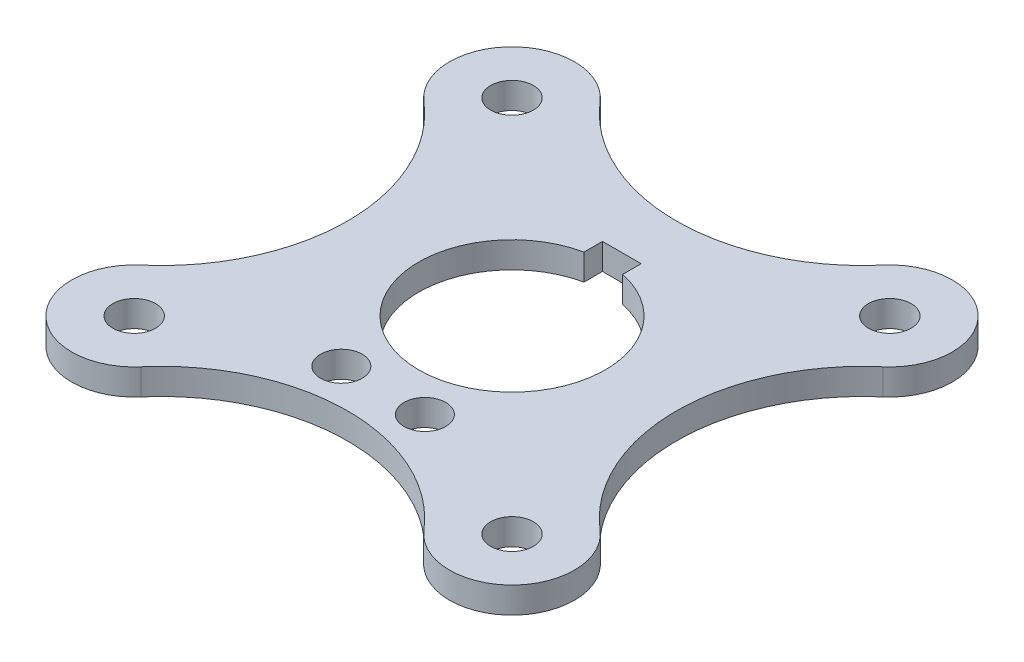
ISO-10303-21;
HEADER;
FILE_DESCRIPTION(('STEP AP214'),'2;1');
FILE_NAME('part.step','',(''),(''),'','','');
FILE_SCHEMA(('AUTOMOTIVE_DESIGN { 1 0 10303 214 1 1 1 1 }'));
ENDSEC;
DATA;
#1=APPLICATION_CONTEXT('core data for automotive mechanical design processes');
#2=APPLICATION_PROTOCOL_DEFINITION('international standard','automotive_design',2000,#1);
#3=PRODUCT_CONTEXT('',#1,'mechanical');
#4=PRODUCT('Part','Part','',(#3));
#5=PRODUCT_RELATED_PRODUCT_CATEGORY('part','',(#4));
#6=PRODUCT_DEFINITION_FORMATION('','',#4);
#7=PRODUCT_DEFINITION_CONTEXT('part definition',#1,'design');
#8=PRODUCT_DEFINITION('design','',#6,#7);
#9=PRODUCT_DEFINITION_SHAPE('','',#8);
#10=(LENGTH_UNIT() NAMED_UNIT(*) SI_UNIT(.MILLI.,.METRE.));
#11=(NAMED_UNIT(*) PLANE_ANGLE_UNIT() SI_UNIT($,.RADIAN.));
#12=(NAMED_UNIT(*) SI_UNIT($,.STERADIAN.) SOLID_ANGLE_UNIT());
#13=UNCERTAINTY_MEASURE_WITH_UNIT(LENGTH_MEASURE(1.E-05),#10,'distance_accuracy_value','');
#14=(GEOMETRIC_REPRESENTATION_CONTEXT(3) GLOBAL_UNCERTAINTY_ASSIGNED_CONTEXT((#13)) GLOBAL_UNIT_ASSIGNED_CONTEXT((#10,
#11,#12)) REPRESENTATION_CONTEXT('',''));
#15=CARTESIAN_POINT('',(0.,0.,0.));
#16=DIRECTION('',(0.,0.,1.));
#17=DIRECTION('',(1.,0.,0.));
#18=AXIS2_PLACEMENT_3D('',#15,#16,#17);
#19=CARTESIAN_POINT('',(-32.813907500035,3.175,-11.4904851942816));
#20=DIRECTION('',(0.,1.,0.));
#21=DIRECTION('',(0.,0.,1.));
#22=AXIS2_PLACEMENT_3D('',#19,#20,#21);
#23=PLANE('',#22);
#24=CARTESIAN_POINT('',(-5.08,3.175,15.6797222222222));
#25=DIRECTION('',(0.,1.,0.));
#26=DIRECTION('',(0.,0.,1.));
#27=AXIS2_PLACEMENT_3D('',#24,#25,#26);
#28=CIRCLE('',#27,2.54);
#29=CARTESIAN_POINT('',(-5.08,3.175,18.2197222222222));
#30=VERTEX_POINT('',#29);
#31=EDGE_CURVE('E268',#30,#30,#28,.T.);
#32=ORIENTED_EDGE('',*,*,#31,.F.);
#33=EDGE_LOOP('',(#32));
#34=FACE_BOUND('',#33,.T.);
#35=CARTESIAN_POINT('',(5.08,3.175,15.6797222222222));
#36=DIRECTION('',(0.,1.,0.));
#37=DIRECTION('',(0.,0.,1.));
#38=AXIS2_PLACEMENT_3D('',#35,#36,#37);
#39=CIRCLE('',#38,2.54);
#40=CARTESIAN_POINT('',(5.08,3.175,18.2197222222222));
#41=VERTEX_POINT('',#40);
#42=EDGE_CURVE('E276',#41,#41,#39,.T.);
#43=ORIENTED_EDGE('',*,*,#42,.F.);
#44=EDGE_LOOP('',(#43));
#45=FACE_BOUND('',#44,.T.);
#46=CARTESIAN_POINT('',(-22.980970388563,3.175,22.9809703885626));
#47=DIRECTION('',(0.,1.,0.));
#48=DIRECTION('',(0.,0.,1.));
#49=AXIS2_PLACEMENT_3D('',#46,#47,#48);
#50=CIRCLE('',#49,2.6);
#51=CARTESIAN_POINT('',(-22.980970388563,3.175,25.5809703885626));
#52=VERTEX_POINT('',#51);
#53=EDGE_CURVE('E292',#52,#52,#50,.T.);
#54=ORIENTED_EDGE('',*,*,#53,.F.);
#55=EDGE_LOOP('',(#54));
#56=FACE_BOUND('',#55,.T.);
#57=CARTESIAN_POINT('',(22.9809703885628,3.175,-22.9809703885628));
#58=DIRECTION('',(0.,1.,0.));
#59=DIRECTION('',(0.,0.,1.));
#60=AXIS2_PLACEMENT_3D('',#57,#58,#59);
#61=CIRCLE('',#60,2.6);
#62=CARTESIAN_POINT('',(22.9809703885628,3.175,-20.3809703885628));
#63=VERTEX_POINT('',#62);
#64=EDGE_CURVE('E174',#63,#63,#61,.T.);
#65=ORIENTED_EDGE('',*,*,#64,.F.);
#66=EDGE_LOOP('',(#65));
#67=FACE_BOUND('',#66,.T.);
#68=CARTESIAN_POINT('',(-42.6468446115075,3.175,0.));
#69=DIRECTION('',(0.,-1.,0.));
#70=DIRECTION('',(0.,0.,1.));
#71=AXIS2_PLACEMENT_3D('',#68,#69,#70);
#72=CIRCLE('',#71,22.6468446115076);
#73=CARTESIAN_POINT('',(-27.922333562608,3.175,-17.2066366623063));
#74=VERTEX_POINT('',#73);
#75=CARTESIAN_POINT('',(-27.9223335626085,3.175,17.2066366623057));
#76=VERTEX_POINT('',#75);
#77=EDGE_CURVE('E190',#74,#76,#72,.T.);
#78=ORIENTED_EDGE('',*,*,#77,.T.);
#79=CARTESIAN_POINT('',(-22.980970388563,3.175,22.9809703885626));
#80=DIRECTION('',(0.,1.,0.));
#81=DIRECTION('',(0.,0.,1.));
#82=AXIS2_PLACEMENT_3D('',#79,#80,#81);
#83=CIRCLE('',#82,7.6);
#84=CARTESIAN_POINT('',(-17.2066366623062,3.175,27.9223335626081));
#85=VERTEX_POINT('',#84);
#86=EDGE_CURVE('E194',#76,#85,#83,.T.);
#87=ORIENTED_EDGE('',*,*,#86,.T.);
#88=CARTESIAN_POINT('',(0.,3.175,42.6468446115075));
#89=DIRECTION('',(0.,-1.,0.));
#90=DIRECTION('',(0.,0.,1.));
#91=AXIS2_PLACEMENT_3D('',#88,#89,#90);
#92=CIRCLE('',#91,22.6468446115075);
#93=CARTESIAN_POINT('',(17.2066366623059,3.175,27.9223335626083));
#94=VERTEX_POINT('',#93);
#95=EDGE_CURVE('E198',#85,#94,#92,.T.);
#96=ORIENTED_EDGE('',*,*,#95,.T.);
#97=CARTESIAN_POINT('',(22.9809703885627,3.175,22.9809703885629));
#98=DIRECTION('',(0.,1.,0.));
#99=DIRECTION('',(0.,0.,1.));
#100=AXIS2_PLACEMENT_3D('',#97,#98,#99);
#101=CIRCLE('',#100,7.6);
#102=CARTESIAN_POINT('',(27.9223335626082,3.175,17.2066366623061));
#103=VERTEX_POINT('',#102);
#104=EDGE_CURVE('E201',#94,#103,#101,.T.);
#105=ORIENTED_EDGE('',*,*,#104,.T.);
#106=CARTESIAN_POINT('',(42.6468446115075,3.175,0.));
#107=DIRECTION('',(0.,-1.,0.));
#108=DIRECTION('',(0.,0.,1.));
#109=AXIS2_PLACEMENT_3D('',#106,#107,#108);
#110=CIRCLE('',#109,22.6468446115075);
#111=CARTESIAN_POINT('',(27.9223335626083,3.175,-17.2066366623059));
#112=VERTEX_POINT('',#111);
#113=EDGE_CURVE('E204',#103,#112,#110,.T.);
#114=ORIENTED_EDGE('',*,*,#113,.T.);
#115=CARTESIAN_POINT('',(22.9809703885628,3.175,-22.9809703885627));
#116=DIRECTION('',(0.,1.,0.));
#117=DIRECTION('',(0.,0.,1.));
#118=AXIS2_PLACEMENT_3D('',#115,#116,#117);
#119=CIRCLE('',#118,7.60000000000001);
#120=CARTESIAN_POINT('',(17.206636662306,3.175,-27.9223335626083));
#121=VERTEX_POINT('',#120);
#122=EDGE_CURVE('E207',#112,#121,#119,.T.);
#123=ORIENTED_EDGE('',*,*,#122,.T.);
#124=CARTESIAN_POINT('',(0.,3.175,-42.6468446115075));
#125=DIRECTION('',(0.,-1.,0.));
#126=DIRECTION('',(0.,0.,1.));
#127=AXIS2_PLACEMENT_3D('',#124,#125,#126);
#128=CIRCLE('',#127,22.6468446115075);
#129=CARTESIAN_POINT('',(-17.2066366623059,3.175,-27.9223335626084));
#130=VERTEX_POINT('',#129);
#131=EDGE_CURVE('E210',#121,#130,#128,.T.);
#132=ORIENTED_EDGE('',*,*,#131,.T.);
#133=CARTESIAN_POINT('',(-22.9809703885625,3.175,-22.9809703885631));
#134=DIRECTION('',(0.,1.,0.));
#135=DIRECTION('',(0.,0.,1.));
#136=AXIS2_PLACEMENT_3D('',#133,#134,#135);
#137=CIRCLE('',#136,7.60000000000001);
#138=EDGE_CURVE('E213',#130,#74,#137,.T.);
#139=ORIENTED_EDGE('',*,*,#138,.T.);
#140=EDGE_LOOP('',(#78,#87,#96,#105,#114,#123,#132,#139));
#141=FACE_BOUND('',#140,.T.);
#142=CARTESIAN_POINT('',(0.,3.175,0.));
#143=DIRECTION('',(0.,1.,0.));
#144=DIRECTION('',(0.,0.,1.));
#145=AXIS2_PLACEMENT_3D('',#142,#143,#144);
#146=CIRCLE('',#145,11.3594444444444);
#147=CARTESIAN_POINT('',(-2.35326156738769,3.175,-11.113016605849));
#148=VERTEX_POINT('',#147);
#149=CARTESIAN_POINT('',(2.3532615673877,3.175,-11.113016605849));
#150=VERTEX_POINT('',#149);
#151=EDGE_CURVE('E148',#148,#150,#146,.T.);
#152=ORIENTED_EDGE('',*,*,#151,.F.);
#153=DIRECTION('',(0.,0.,1.));
#154=VECTOR('',#153,1.);
#155=CARTESIAN_POINT('',(-2.3532615673877,3.175,-13.3594444444444));
#156=LINE('',#155,#154);
#157=CARTESIAN_POINT('',(-2.3532615673877,3.175,-13.3594444444444));
#158=VERTEX_POINT('',#157);
#159=EDGE_CURVE('E139',#158,#148,#156,.T.);
#160=ORIENTED_EDGE('',*,*,#159,.F.);
#161=DIRECTION('',(-1.,0.,0.));
#162=VECTOR('',#161,1.);
#163=CARTESIAN_POINT('',(2.3532615673877,3.175,-13.3594444444444));
#164=LINE('',#163,#162);
#165=CARTESIAN_POINT('',(2.35326156738769,3.175,-13.3594444444444));
#166=VERTEX_POINT('',#165);
#167=EDGE_CURVE('E166',#166,#158,#164,.T.);
#168=ORIENTED_EDGE('',*,*,#167,.F.);
#169=DIRECTION('',(0.,0.,-1.));
#170=VECTOR('',#169,1.);
#171=CARTESIAN_POINT('',(2.3532615673877,3.175,-13.3594444444444));
#172=LINE('',#171,#170);
#173=EDGE_CURVE('E162',#150,#166,#172,.T.);
#174=ORIENTED_EDGE('',*,*,#173,.F.);
#175=EDGE_LOOP('',(#152,#160,#168,#174));
#176=FACE_BOUND('',#175,.T.);
#177=CARTESIAN_POINT('',(22.9809703885627,3.175,22.9809703885629));
#178=DIRECTION('',(0.,1.,0.));
#179=DIRECTION('',(0.,0.,1.));
#180=AXIS2_PLACEMENT_3D('',#177,#178,#179);
#181=CIRCLE('',#180,2.6);
#182=CARTESIAN_POINT('',(22.9809703885627,3.175,25.5809703885629));
#183=VERTEX_POINT('',#182);
#184=EDGE_CURVE('E300',#183,#183,#181,.T.);
#185=ORIENTED_EDGE('',*,*,#184,.F.);
#186=EDGE_LOOP('',(#185));
#187=FACE_BOUND('',#186,.T.);
#188=CARTESIAN_POINT('',(-22.9809703885625,3.175,-22.9809703885631));
#189=DIRECTION('',(0.,1.,0.));
#190=DIRECTION('',(0.,0.,1.));
#191=AXIS2_PLACEMENT_3D('',#188,#189,#190);
#192=CIRCLE('',#191,2.6);
#193=CARTESIAN_POINT('',(-22.9809703885625,3.175,-20.3809703885631));
#194=VERTEX_POINT('',#193);
#195=EDGE_CURVE('E284',#194,#194,#192,.T.);
#196=ORIENTED_EDGE('',*,*,#195,.F.);
#197=EDGE_LOOP('',(#196));
#198=FACE_BOUND('',#197,.T.);
#199=ADVANCED_FACE('F47',(#34,#45,#56,#67,#141,#176,#187,#198),#23,.T.);
#200=CARTESIAN_POINT('',(-32.813907500035,0.,-11.4904851942816));
#201=DIRECTION('',(0.,1.,0.));
#202=DIRECTION('',(0.,0.,1.));
#203=AXIS2_PLACEMENT_3D('',#200,#201,#202);
#204=PLANE('',#203);
#205=CARTESIAN_POINT('',(-5.08,0.,15.6797222222222));
#206=DIRECTION('',(0.,1.,0.));
#207=DIRECTION('',(0.,0.,1.));
#208=AXIS2_PLACEMENT_3D('',#205,#206,#207);
#209=CIRCLE('',#208,2.54);
#210=CARTESIAN_POINT('',(-5.08,0.,18.2197222222222));
#211=VERTEX_POINT('',#210);
#212=EDGE_CURVE('E51',#211,#211,#209,.T.);
#213=ORIENTED_EDGE('',*,*,#212,.T.);
#214=EDGE_LOOP('',(#213));
#215=FACE_BOUND('',#214,.T.);
#216=CARTESIAN_POINT('',(5.08,0.,15.6797222222222));
#217=DIRECTION('',(0.,1.,0.));
#218=DIRECTION('',(0.,0.,1.));
#219=AXIS2_PLACEMENT_3D('',#216,#217,#218);
#220=CIRCLE('',#219,2.54);
#221=CARTESIAN_POINT('',(5.08,0.,18.2197222222222));
#222=VERTEX_POINT('',#221);
#223=EDGE_CURVE('E265',#222,#222,#220,.T.);
#224=ORIENTED_EDGE('',*,*,#223,.T.);
#225=EDGE_LOOP('',(#224));
#226=FACE_BOUND('',#225,.T.);
#227=CARTESIAN_POINT('',(-42.6468446115075,0.,0.));
#228=DIRECTION('',(0.,-1.,0.));
#229=DIRECTION('',(0.,0.,1.));
#230=AXIS2_PLACEMENT_3D('',#227,#228,#229);
#231=CIRCLE('',#230,22.6468446115076);
#232=CARTESIAN_POINT('',(-27.922333562608,0.,-17.2066366623063));
#233=VERTEX_POINT('',#232);
#234=CARTESIAN_POINT('',(-27.9223335626085,0.,17.2066366623057));
#235=VERTEX_POINT('',#234);
#236=EDGE_CURVE('E157',#233,#235,#231,.T.);
#237=ORIENTED_EDGE('',*,*,#236,.F.);
#238=CARTESIAN_POINT('',(-22.9809703885625,0.,-22.9809703885631));
#239=DIRECTION('',(0.,1.,0.));
#240=DIRECTION('',(0.,0.,1.));
#241=AXIS2_PLACEMENT_3D('',#238,#239,#240);
#242=CIRCLE('',#241,7.60000000000001);
#243=CARTESIAN_POINT('',(-17.2066366623059,0.,-27.9223335626084));
#244=VERTEX_POINT('',#243);
#245=EDGE_CURVE('E195',#244,#233,#242,.T.);
#246=ORIENTED_EDGE('',*,*,#245,.F.);
#247=CARTESIAN_POINT('',(0.,0.,-42.6468446115075));
#248=DIRECTION('',(0.,-1.,0.));
#249=DIRECTION('',(0.,0.,1.));
#250=AXIS2_PLACEMENT_3D('',#247,#248,#249);
#251=CIRCLE('',#250,22.6468446115075);
#252=CARTESIAN_POINT('',(17.206636662306,0.,-27.9223335626083));
#253=VERTEX_POINT('',#252);
#254=EDGE_CURVE('E235',#253,#244,#251,.T.);
#255=ORIENTED_EDGE('',*,*,#254,.F.);
#256=CARTESIAN_POINT('',(22.9809703885628,0.,-22.9809703885627));
#257=DIRECTION('',(0.,1.,0.));
#258=DIRECTION('',(0.,0.,1.));
#259=AXIS2_PLACEMENT_3D('',#256,#257,#258);
#260=CIRCLE('',#259,7.60000000000001);
#261=CARTESIAN_POINT('',(27.9223335626083,0.,-17.2066366623059));
#262=VERTEX_POINT('',#261);
#263=EDGE_CURVE('E232',#262,#253,#260,.T.);
#264=ORIENTED_EDGE('',*,*,#263,.F.);
#265=CARTESIAN_POINT('',(42.6468446115075,0.,0.));
#266=DIRECTION('',(0.,-1.,0.));
#267=DIRECTION('',(0.,0.,1.));
#268=AXIS2_PLACEMENT_3D('',#265,#266,#267);
#269=CIRCLE('',#268,22.6468446115075);
#270=CARTESIAN_POINT('',(27.9223335626082,0.,17.2066366623061));
#271=VERTEX_POINT('',#270);
#272=EDGE_CURVE('E229',#271,#262,#269,.T.);
#273=ORIENTED_EDGE('',*,*,#272,.F.);
#274=CARTESIAN_POINT('',(22.9809703885627,0.,22.9809703885629));
#275=DIRECTION('',(0.,1.,0.));
#276=DIRECTION('',(0.,0.,1.));
#277=AXIS2_PLACEMENT_3D('',#274,#275,#276);
#278=CIRCLE('',#277,7.6);
#279=CARTESIAN_POINT('',(17.2066366623059,0.,27.9223335626083));
#280=VERTEX_POINT('',#279);
#281=EDGE_CURVE('E226',#280,#271,#278,.T.);
#282=ORIENTED_EDGE('',*,*,#281,.F.);
#283=CARTESIAN_POINT('',(0.,0.,42.6468446115075));
#284=DIRECTION('',(0.,-1.,0.));
#285=DIRECTION('',(0.,0.,1.));
#286=AXIS2_PLACEMENT_3D('',#283,#284,#285);
#287=CIRCLE('',#286,22.6468446115075);
#288=CARTESIAN_POINT('',(-17.2066366623062,0.,27.9223335626081));
#289=VERTEX_POINT('',#288);
#290=EDGE_CURVE('E223',#289,#280,#287,.T.);
#291=ORIENTED_EDGE('',*,*,#290,.F.);
#292=CARTESIAN_POINT('',(-22.980970388563,0.,22.9809703885626));
#293=DIRECTION('',(0.,1.,0.));
#294=DIRECTION('',(0.,0.,1.));
#295=AXIS2_PLACEMENT_3D('',#292,#293,#294);
#296=CIRCLE('',#295,7.6);
#297=EDGE_CURVE('E220',#235,#289,#296,.T.);
#298=ORIENTED_EDGE('',*,*,#297,.F.);
#299=EDGE_LOOP('',(#237,#246,#255,#264,#273,#282,#291,#298));
#300=FACE_BOUND('',#299,.T.);
#301=DIRECTION('',(0.,0.,1.));
#302=VECTOR('',#301,1.);
#303=CARTESIAN_POINT('',(-2.3532615673877,0.,-13.3594444444444));
#304=LINE('',#303,#302);
#305=CARTESIAN_POINT('',(-2.3532615673877,0.,-13.3594444444444));
#306=VERTEX_POINT('',#305);
#307=CARTESIAN_POINT('',(-2.35326156738769,0.,-11.113016605849));
#308=VERTEX_POINT('',#307);
#309=EDGE_CURVE('E73',#306,#308,#304,.T.);
#310=ORIENTED_EDGE('',*,*,#309,.T.);
#311=CARTESIAN_POINT('',(0.,0.,0.));
#312=DIRECTION('',(0.,1.,0.));
#313=DIRECTION('',(0.,0.,1.));
#314=AXIS2_PLACEMENT_3D('',#311,#312,#313);
#315=CIRCLE('',#314,11.3594444444444);
#316=CARTESIAN_POINT('',(2.3532615673877,0.,-11.113016605849));
#317=VERTEX_POINT('',#316);
#318=EDGE_CURVE('E155',#308,#317,#315,.T.);
#319=ORIENTED_EDGE('',*,*,#318,.T.);
#320=DIRECTION('',(0.,0.,-1.));
#321=VECTOR('',#320,1.);
#322=CARTESIAN_POINT('',(2.3532615673877,0.,-13.3594444444444));
#323=LINE('',#322,#321);
#324=CARTESIAN_POINT('',(2.3532615673877,0.,-13.3594444444444));
#325=VERTEX_POINT('',#324);
#326=EDGE_CURVE('E177',#317,#325,#323,.T.);
#327=ORIENTED_EDGE('',*,*,#326,.T.);
#328=DIRECTION('',(-1.,0.,0.));
#329=VECTOR('',#328,1.);
#330=CARTESIAN_POINT('',(2.3532615673877,0.,-13.3594444444444));
#331=LINE('',#330,#329);
#332=EDGE_CURVE('E149',#325,#306,#331,.T.);
#333=ORIENTED_EDGE('',*,*,#332,.T.);
#334=EDGE_LOOP('',(#310,#319,#327,#333));
#335=FACE_BOUND('',#334,.T.);
#336=CARTESIAN_POINT('',(22.9809703885628,0.,-22.9809703885628));
#337=DIRECTION('',(0.,1.,0.));
#338=DIRECTION('',(0.,0.,1.));
#339=AXIS2_PLACEMENT_3D('',#336,#337,#338);
#340=CIRCLE('',#339,2.6);
#341=CARTESIAN_POINT('',(22.9809703885628,0.,-20.3809703885628));
#342=VERTEX_POINT('',#341);
#343=EDGE_CURVE('E304',#342,#342,#340,.T.);
#344=ORIENTED_EDGE('',*,*,#343,.T.);
#345=EDGE_LOOP('',(#344));
#346=FACE_BOUND('',#345,.T.);
#347=CARTESIAN_POINT('',(22.9809703885627,0.,22.9809703885629));
#348=DIRECTION('',(0.,1.,0.));
#349=DIRECTION('',(0.,0.,1.));
#350=AXIS2_PLACEMENT_3D('',#347,#348,#349);
#351=CIRCLE('',#350,2.6);
#352=CARTESIAN_POINT('',(22.9809703885627,0.,25.5809703885629));
#353=VERTEX_POINT('',#352);
#354=EDGE_CURVE('E296',#353,#353,#351,.T.);
#355=ORIENTED_EDGE('',*,*,#354,.T.);
#356=EDGE_LOOP('',(#355));
#357=FACE_BOUND('',#356,.T.);
#358=CARTESIAN_POINT('',(-22.980970388563,0.,22.9809703885626));
#359=DIRECTION('',(0.,1.,0.));
#360=DIRECTION('',(0.,0.,1.));
#361=AXIS2_PLACEMENT_3D('',#358,#359,#360);
#362=CIRCLE('',#361,2.6);
#363=CARTESIAN_POINT('',(-22.980970388563,0.,25.5809703885626));
#364=VERTEX_POINT('',#363);
#365=EDGE_CURVE('E288',#364,#364,#362,.T.);
#366=ORIENTED_EDGE('',*,*,#365,.T.);
#367=EDGE_LOOP('',(#366));
#368=FACE_BOUND('',#367,.T.);
#369=CARTESIAN_POINT('',(-22.9809703885625,0.,-22.9809703885631));
#370=DIRECTION('',(0.,1.,0.));
#371=DIRECTION('',(0.,0.,1.));
#372=AXIS2_PLACEMENT_3D('',#369,#370,#371);
#373=CIRCLE('',#372,2.6);
#374=CARTESIAN_POINT('',(-22.9809703885625,0.,-20.3809703885631));
#375=VERTEX_POINT('',#374);
#376=EDGE_CURVE('E274',#375,#375,#373,.T.);
#377=ORIENTED_EDGE('',*,*,#376,.T.);
#378=EDGE_LOOP('',(#377));
#379=FACE_BOUND('',#378,.T.);
#380=ADVANCED_FACE('F314',(#215,#226,#300,#335,#346,#357,#368,#379),#204,.F.);
#381=CARTESIAN_POINT('',(-42.6468446115075,3.175,0.));
#382=DIRECTION('',(0.,-1.,0.));
#383=DIRECTION('',(0.,0.,-1.));
#384=AXIS2_PLACEMENT_3D('',#381,#382,#383);
#385=CYLINDRICAL_SURFACE('',#384,22.6468446115076);
#386=ORIENTED_EDGE('',*,*,#236,.T.);
#387=DIRECTION('',(0.,-1.,0.));
#388=VECTOR('',#387,1.);
#389=CARTESIAN_POINT('',(-27.9223335626085,3.175,17.2066366623057));
#390=LINE('',#389,#388);
#391=EDGE_CURVE('E11',#76,#235,#390,.T.);
#392=ORIENTED_EDGE('',*,*,#391,.F.);
#393=ORIENTED_EDGE('',*,*,#77,.F.);
#394=DIRECTION('',(0.,-1.,0.));
#395=VECTOR('',#394,1.);
#396=CARTESIAN_POINT('',(-27.922333562608,3.175,-17.2066366623063));
#397=LINE('',#396,#395);
#398=EDGE_CURVE('E216',#74,#233,#397,.T.);
#399=ORIENTED_EDGE('',*,*,#398,.T.);
#400=EDGE_LOOP('',(#386,#392,#393,#399));
#401=FACE_BOUND('',#400,.T.);
#402=ADVANCED_FACE('F49',(#401),#385,.F.);
#403=CARTESIAN_POINT('',(-22.980970388563,3.175,22.9809703885626));
#404=DIRECTION('',(0.,-1.,0.));
#405=DIRECTION('',(0.,0.,-1.));
#406=AXIS2_PLACEMENT_3D('',#403,#404,#405);
#407=CYLINDRICAL_SURFACE('',#406,7.6);
#408=ORIENTED_EDGE('',*,*,#297,.T.);
#409=DIRECTION('',(0.,-1.,0.));
#410=VECTOR('',#409,1.);
#411=CARTESIAN_POINT('',(-17.2066366623062,3.175,27.9223335626081));
#412=LINE('',#411,#410);
#413=EDGE_CURVE('E57',#85,#289,#412,.T.);
#414=ORIENTED_EDGE('',*,*,#413,.F.);
#415=ORIENTED_EDGE('',*,*,#86,.F.);
#416=ORIENTED_EDGE('',*,*,#391,.T.);
#417=EDGE_LOOP('',(#408,#414,#415,#416));
#418=FACE_BOUND('',#417,.T.);
#419=ADVANCED_FACE('F367',(#418),#407,.T.);
#420=CARTESIAN_POINT('',(0.,3.175,42.6468446115075));
#421=DIRECTION('',(0.,-1.,0.));
#422=DIRECTION('',(0.,0.,-1.));
#423=AXIS2_PLACEMENT_3D('',#420,#421,#422);
#424=CYLINDRICAL_SURFACE('',#423,22.6468446115075);
#425=ORIENTED_EDGE('',*,*,#290,.T.);
#426=DIRECTION('',(0.,-1.,0.));
#427=VECTOR('',#426,1.);
#428=CARTESIAN_POINT('',(17.2066366623059,3.175,27.9223335626083));
#429=LINE('',#428,#427);
#430=EDGE_CURVE('E259',#94,#280,#429,.T.);
#431=ORIENTED_EDGE('',*,*,#430,.F.);
#432=ORIENTED_EDGE('',*,*,#95,.F.);
#433=ORIENTED_EDGE('',*,*,#413,.T.);
#434=EDGE_LOOP('',(#425,#431,#432,#433));
#435=FACE_BOUND('',#434,.T.);
#436=ADVANCED_FACE('F364',(#435),#424,.F.);
#437=CARTESIAN_POINT('',(22.9809703885627,3.175,22.9809703885629));
#438=DIRECTION('',(0.,-1.,0.));
#439=DIRECTION('',(0.,0.,-1.));
#440=AXIS2_PLACEMENT_3D('',#437,#438,#439);
#441=CYLINDRICAL_SURFACE('',#440,7.6);
#442=ORIENTED_EDGE('',*,*,#281,.T.);
#443=DIRECTION('',(0.,-1.,0.));
#444=VECTOR('',#443,1.);
#445=CARTESIAN_POINT('',(27.9223335626082,3.175,17.2066366623061));
#446=LINE('',#445,#444);
#447=EDGE_CURVE('E255',#103,#271,#446,.T.);
#448=ORIENTED_EDGE('',*,*,#447,.F.);
#449=ORIENTED_EDGE('',*,*,#104,.F.);
#450=ORIENTED_EDGE('',*,*,#430,.T.);
#451=EDGE_LOOP('',(#442,#448,#449,#450));
#452=FACE_BOUND('',#451,.T.);
#453=ADVANCED_FACE('F360',(#452),#441,.T.);
#454=CARTESIAN_POINT('',(42.6468446115075,3.175,0.));
#455=DIRECTION('',(0.,-1.,0.));
#456=DIRECTION('',(0.,0.,-1.));
#457=AXIS2_PLACEMENT_3D('',#454,#455,#456);
#458=CYLINDRICAL_SURFACE('',#457,22.6468446115075);
#459=ORIENTED_EDGE('',*,*,#272,.T.);
#460=DIRECTION('',(0.,-1.,0.));
#461=VECTOR('',#460,1.);
#462=CARTESIAN_POINT('',(27.9223335626083,3.175,-17.2066366623059));
#463=LINE('',#462,#461);
#464=EDGE_CURVE('E251',#112,#262,#463,.T.);
#465=ORIENTED_EDGE('',*,*,#464,.F.);
#466=ORIENTED_EDGE('',*,*,#113,.F.);
#467=ORIENTED_EDGE('',*,*,#447,.T.);
#468=EDGE_LOOP('',(#459,#465,#466,#467));
#469=FACE_BOUND('',#468,.T.);
#470=ADVANCED_FACE('F356',(#469),#458,.F.);
#471=CARTESIAN_POINT('',(22.9809703885628,3.175,-22.9809703885627));
#472=DIRECTION('',(0.,-1.,0.));
#473=DIRECTION('',(0.,0.,-1.));
#474=AXIS2_PLACEMENT_3D('',#471,#472,#473);
#475=CYLINDRICAL_SURFACE('',#474,7.60000000000001);
#476=ORIENTED_EDGE('',*,*,#263,.T.);
#477=DIRECTION('',(0.,-1.,0.));
#478=VECTOR('',#477,1.);
#479=CARTESIAN_POINT('',(17.206636662306,3.175,-27.9223335626083));
#480=LINE('',#479,#478);
#481=EDGE_CURVE('E247',#121,#253,#480,.T.);
#482=ORIENTED_EDGE('',*,*,#481,.F.);
#483=ORIENTED_EDGE('',*,*,#122,.F.);
#484=ORIENTED_EDGE('',*,*,#464,.T.);
#485=EDGE_LOOP('',(#476,#482,#483,#484));
#486=FACE_BOUND('',#485,.T.);
#487=ADVANCED_FACE('F352',(#486),#475,.T.);
#488=CARTESIAN_POINT('',(0.,3.175,-42.6468446115075));
#489=DIRECTION('',(0.,-1.,0.));
#490=DIRECTION('',(0.,0.,-1.));
#491=AXIS2_PLACEMENT_3D('',#488,#489,#490);
#492=CYLINDRICAL_SURFACE('',#491,22.6468446115075);
#493=ORIENTED_EDGE('',*,*,#254,.T.);
#494=DIRECTION('',(0.,-1.,0.));
#495=VECTOR('',#494,1.);
#496=CARTESIAN_POINT('',(-17.2066366623059,3.175,-27.9223335626084));
#497=LINE('',#496,#495);
#498=EDGE_CURVE('E243',#130,#244,#497,.T.);
#499=ORIENTED_EDGE('',*,*,#498,.F.);
#500=ORIENTED_EDGE('',*,*,#131,.F.);
#501=ORIENTED_EDGE('',*,*,#481,.T.);
#502=EDGE_LOOP('',(#493,#499,#500,#501));
#503=FACE_BOUND('',#502,.T.);
#504=ADVANCED_FACE('F348',(#503),#492,.F.);
#505=CARTESIAN_POINT('',(-22.9809703885625,3.175,-22.9809703885631));
#506=DIRECTION('',(0.,-1.,0.));
#507=DIRECTION('',(0.,0.,-1.));
#508=AXIS2_PLACEMENT_3D('',#505,#506,#507);
#509=CYLINDRICAL_SURFACE('',#508,7.60000000000001);
#510=ORIENTED_EDGE('',*,*,#245,.T.);
#511=ORIENTED_EDGE('',*,*,#398,.F.);
#512=ORIENTED_EDGE('',*,*,#138,.F.);
#513=ORIENTED_EDGE('',*,*,#498,.T.);
#514=EDGE_LOOP('',(#510,#511,#512,#513));
#515=FACE_BOUND('',#514,.T.);
#516=ADVANCED_FACE('F345',(#515),#509,.T.);
#517=CARTESIAN_POINT('',(-2.3532615673877,3.175,-13.3594444444444));
#518=DIRECTION('',(1.,0.,0.));
#519=DIRECTION('',(0.,0.,-1.));
#520=AXIS2_PLACEMENT_3D('',#517,#518,#519);
#521=PLANE('',#520);
#522=ORIENTED_EDGE('',*,*,#309,.F.);
#523=DIRECTION('',(0.,-1.,0.));
#524=VECTOR('',#523,1.);
#525=CARTESIAN_POINT('',(-2.3532615673877,3.175,-13.3594444444444));
#526=LINE('',#525,#524);
#527=EDGE_CURVE('E143',#158,#306,#526,.T.);
#528=ORIENTED_EDGE('',*,*,#527,.F.);
#529=ORIENTED_EDGE('',*,*,#159,.T.);
#530=DIRECTION('',(0.,-1.,0.));
#531=VECTOR('',#530,1.);
#532=CARTESIAN_POINT('',(-2.35326156738769,3.175,-11.113016605849));
#533=LINE('',#532,#531);
#534=EDGE_CURVE('E142',#148,#308,#533,.T.);
#535=ORIENTED_EDGE('',*,*,#534,.T.);
#536=EDGE_LOOP('',(#522,#528,#529,#535));
#537=FACE_BOUND('',#536,.T.);
#538=ADVANCED_FACE('F141',(#537),#521,.T.);
#539=CARTESIAN_POINT('',(0.,3.175,0.));
#540=DIRECTION('',(0.,-1.,0.));
#541=DIRECTION('',(0.,0.,-1.));
#542=AXIS2_PLACEMENT_3D('',#539,#540,#541);
#543=CYLINDRICAL_SURFACE('',#542,11.3594444444444);
#544=ORIENTED_EDGE('',*,*,#318,.F.);
#545=ORIENTED_EDGE('',*,*,#534,.F.);
#546=ORIENTED_EDGE('',*,*,#151,.T.);
#547=DIRECTION('',(0.,-1.,0.));
#548=VECTOR('',#547,1.);
#549=CARTESIAN_POINT('',(2.3532615673877,3.175,-11.113016605849));
#550=LINE('',#549,#548);
#551=EDGE_CURVE('E158',#150,#317,#550,.T.);
#552=ORIENTED_EDGE('',*,*,#551,.T.);
#553=EDGE_LOOP('',(#544,#545,#546,#552));
#554=FACE_BOUND('',#553,.T.);
#555=ADVANCED_FACE('F152',(#554),#543,.F.);
#556=CARTESIAN_POINT('',(2.3532615673877,3.175,-13.3594444444444));
#557=DIRECTION('',(-1.,0.,0.));
#558=DIRECTION('',(0.,0.,1.));
#559=AXIS2_PLACEMENT_3D('',#556,#557,#558);
#560=PLANE('',#559);
#561=ORIENTED_EDGE('',*,*,#326,.F.);
#562=ORIENTED_EDGE('',*,*,#551,.F.);
#563=ORIENTED_EDGE('',*,*,#173,.T.);
#564=DIRECTION('',(0.,-1.,0.));
#565=VECTOR('',#564,1.);
#566=CARTESIAN_POINT('',(2.3532615673877,3.175,-13.3594444444444));
#567=LINE('',#566,#565);
#568=EDGE_CURVE('E65',#166,#325,#567,.T.);
#569=ORIENTED_EDGE('',*,*,#568,.T.);
#570=EDGE_LOOP('',(#561,#562,#563,#569));
#571=FACE_BOUND('',#570,.T.);
#572=ADVANCED_FACE('F330',(#571),#560,.T.);
#573=CARTESIAN_POINT('',(2.3532615673877,3.175,-13.3594444444444));
#574=DIRECTION('',(0.,0.,1.));
#575=DIRECTION('',(1.,0.,0.));
#576=AXIS2_PLACEMENT_3D('',#573,#574,#575);
#577=PLANE('',#576);
#578=ORIENTED_EDGE('',*,*,#332,.F.);
#579=ORIENTED_EDGE('',*,*,#568,.F.);
#580=ORIENTED_EDGE('',*,*,#167,.T.);
#581=ORIENTED_EDGE('',*,*,#527,.T.);
#582=EDGE_LOOP('',(#578,#579,#580,#581));
#583=FACE_BOUND('',#582,.T.);
#584=ADVANCED_FACE('F320',(#583),#577,.T.);
#585=CARTESIAN_POINT('',(22.9809703885628,3.175,-22.9809703885628));
#586=DIRECTION('',(0.,-1.,0.));
#587=DIRECTION('',(0.,0.,-1.));
#588=AXIS2_PLACEMENT_3D('',#585,#586,#587);
#589=CYLINDRICAL_SURFACE('',#588,2.6);
#590=ORIENTED_EDGE('',*,*,#64,.T.);
#591=EDGE_LOOP('',(#590));
#592=FACE_BOUND('',#591,.T.);
#593=ORIENTED_EDGE('',*,*,#343,.F.);
#594=EDGE_LOOP('',(#593));
#595=FACE_BOUND('',#594,.T.);
#596=ADVANCED_FACE('F317',(#592,#595),#589,.F.);
#597=CARTESIAN_POINT('',(22.9809703885627,3.175,22.9809703885629));
#598=DIRECTION('',(0.,-1.,0.));
#599=DIRECTION('',(0.,0.,-1.));
#600=AXIS2_PLACEMENT_3D('',#597,#598,#599);
#601=CYLINDRICAL_SURFACE('',#600,2.6);
#602=ORIENTED_EDGE('',*,*,#184,.T.);
#603=EDGE_LOOP('',(#602));
#604=FACE_BOUND('',#603,.T.);
#605=ORIENTED_EDGE('',*,*,#354,.F.);
#606=EDGE_LOOP('',(#605));
#607=FACE_BOUND('',#606,.T.);
#608=ADVANCED_FACE('F319',(#604,#607),#601,.F.);
#609=CARTESIAN_POINT('',(-22.980970388563,3.175,22.9809703885626));
#610=DIRECTION('',(0.,-1.,0.));
#611=DIRECTION('',(0.,0.,-1.));
#612=AXIS2_PLACEMENT_3D('',#609,#610,#611);
#613=CYLINDRICAL_SURFACE('',#612,2.6);
#614=ORIENTED_EDGE('',*,*,#53,.T.);
#615=EDGE_LOOP('',(#614));
#616=FACE_BOUND('',#615,.T.);
#617=ORIENTED_EDGE('',*,*,#365,.F.);
#618=EDGE_LOOP('',(#617));
#619=FACE_BOUND('',#618,.T.);
#620=ADVANCED_FACE('F327',(#616,#619),#613,.F.);
#621=CARTESIAN_POINT('',(-22.9809703885625,3.175,-22.9809703885631));
#622=DIRECTION('',(0.,-1.,0.));
#623=DIRECTION('',(0.,0.,-1.));
#624=AXIS2_PLACEMENT_3D('',#621,#622,#623);
#625=CYLINDRICAL_SURFACE('',#624,2.6);
#626=ORIENTED_EDGE('',*,*,#195,.T.);
#627=EDGE_LOOP('',(#626));
#628=FACE_BOUND('',#627,.T.);
#629=ORIENTED_EDGE('',*,*,#376,.F.);
#630=EDGE_LOOP('',(#629));
#631=FACE_BOUND('',#630,.T.);
#632=ADVANCED_FACE('F472',(#628,#631),#625,.F.);
#633=CARTESIAN_POINT('',(5.08,-6.825,15.6797222222222));
#634=DIRECTION('',(0.,1.,0.));
#635=DIRECTION('',(0.,0.,1.));
#636=AXIS2_PLACEMENT_3D('',#633,#634,#635);
#637=CYLINDRICAL_SURFACE('',#636,2.54);
#638=ORIENTED_EDGE('',*,*,#42,.T.);
#639=EDGE_LOOP('',(#638));
#640=FACE_BOUND('',#639,.T.);
#641=ORIENTED_EDGE('',*,*,#223,.F.);
#642=EDGE_LOOP('',(#641));
#643=FACE_BOUND('',#642,.T.);
#644=ADVANCED_FACE('F467',(#640,#643),#637,.F.);
#645=CARTESIAN_POINT('',(-5.08,-6.825,15.6797222222222));
#646=DIRECTION('',(0.,1.,0.));
#647=DIRECTION('',(0.,0.,1.));
#648=AXIS2_PLACEMENT_3D('',#645,#646,#647);
#649=CYLINDRICAL_SURFACE('',#648,2.54);
#650=ORIENTED_EDGE('',*,*,#31,.T.);
#651=EDGE_LOOP('',(#650));
#652=FACE_BOUND('',#651,.T.);
#653=ORIENTED_EDGE('',*,*,#212,.F.);
#654=EDGE_LOOP('',(#653));
#655=FACE_BOUND('',#654,.T.);
#656=ADVANCED_FACE('F471',(#652,#655),#649,.F.);
#657=CLOSED_SHELL('',(#199,#380,#402,#419,#436,#453,#470,#487,#504,#516,#538,#555,#572,#584,
#596,#608,#620,#632,#644,#656));
#658=MANIFOLD_SOLID_BREP('B2',#657);
#659=ADVANCED_BREP_SHAPE_REPRESENTATION('',(#18,#658),#14);
#660=SHAPE_DEFINITION_REPRESENTATION(#9,#659);
ENDSEC;
END-ISO-10303-21;
